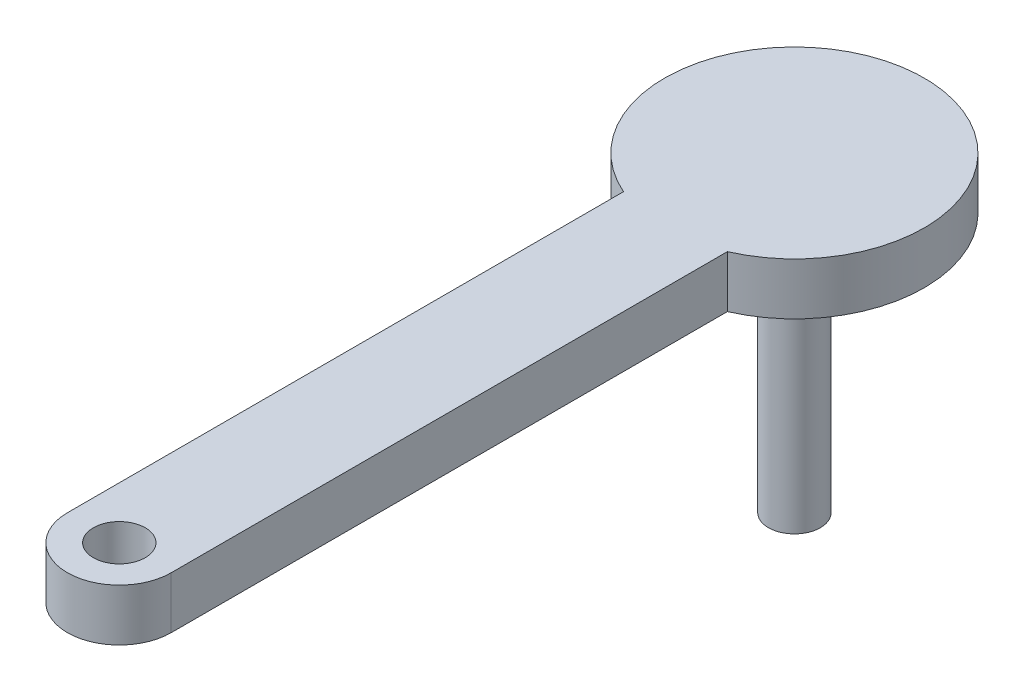
ISO-10303-21;
HEADER;
FILE_DESCRIPTION(('STEP AP214'),'2;1');
FILE_NAME('part.step','',(''),(''),'','','');
FILE_SCHEMA(('AUTOMOTIVE_DESIGN { 1 0 10303 214 1 1 1 1 }'));
ENDSEC;
DATA;
#1=APPLICATION_CONTEXT('core data for automotive mechanical design processes');
#2=APPLICATION_PROTOCOL_DEFINITION('international standard','automotive_design',2000,#1);
#3=PRODUCT_CONTEXT('',#1,'mechanical');
#4=PRODUCT('Part','Part','',(#3));
#5=PRODUCT_RELATED_PRODUCT_CATEGORY('part','',(#4));
#6=PRODUCT_DEFINITION_FORMATION('','',#4);
#7=PRODUCT_DEFINITION_CONTEXT('part definition',#1,'design');
#8=PRODUCT_DEFINITION('design','',#6,#7);
#9=PRODUCT_DEFINITION_SHAPE('','',#8);
#10=(LENGTH_UNIT() NAMED_UNIT(*) SI_UNIT(.MILLI.,.METRE.));
#11=(NAMED_UNIT(*) PLANE_ANGLE_UNIT() SI_UNIT($,.RADIAN.));
#12=(NAMED_UNIT(*) SI_UNIT($,.STERADIAN.) SOLID_ANGLE_UNIT());
#13=UNCERTAINTY_MEASURE_WITH_UNIT(LENGTH_MEASURE(1.E-05),#10,'distance_accuracy_value','');
#14=(GEOMETRIC_REPRESENTATION_CONTEXT(3) GLOBAL_UNCERTAINTY_ASSIGNED_CONTEXT((#13)) GLOBAL_UNIT_ASSIGNED_CONTEXT((#10,
#11,#12)) REPRESENTATION_CONTEXT('',''));
#15=CARTESIAN_POINT('',(0.,0.,0.));
#16=DIRECTION('',(0.,0.,1.));
#17=DIRECTION('',(1.,0.,0.));
#18=AXIS2_PLACEMENT_3D('',#15,#16,#17);
#19=CARTESIAN_POINT('',(0.,-50.,0.));
#20=DIRECTION('',(0.,-1.,0.));
#21=DIRECTION('',(0.,0.,-1.));
#22=AXIS2_PLACEMENT_3D('',#19,#20,#21);
#23=PLANE('',#22);
#24=CARTESIAN_POINT('',(0.,-50.,0.));
#25=DIRECTION('',(0.,-1.,0.));
#26=DIRECTION('',(1.,0.,0.));
#27=AXIS2_PLACEMENT_3D('',#24,#25,#26);
#28=CIRCLE('',#27,5.);
#29=CARTESIAN_POINT('',(5.,-50.,0.));
#30=VERTEX_POINT('',#29);
#31=EDGE_CURVE('E10',#30,#30,#28,.T.);
#32=ORIENTED_EDGE('',*,*,#31,.T.);
#33=EDGE_LOOP('',(#32));
#34=FACE_BOUND('',#33,.T.);
#35=ADVANCED_FACE('F16',(#34),#23,.T.);
#36=CARTESIAN_POINT('',(0.,-50.,0.));
#37=DIRECTION('',(0.,1.,0.));
#38=DIRECTION('',(0.,0.,1.));
#39=AXIS2_PLACEMENT_3D('',#36,#37,#38);
#40=CYLINDRICAL_SURFACE('',#39,5.);
#41=CARTESIAN_POINT('',(0.,0.,0.));
#42=DIRECTION('',(0.,-1.,0.));
#43=DIRECTION('',(1.,0.,0.));
#44=AXIS2_PLACEMENT_3D('',#41,#42,#43);
#45=CIRCLE('',#44,5.);
#46=CARTESIAN_POINT('',(5.,0.,0.));
#47=VERTEX_POINT('',#46);
#48=EDGE_CURVE('E127',#47,#47,#45,.T.);
#49=ORIENTED_EDGE('',*,*,#48,.T.);
#50=EDGE_LOOP('',(#49));
#51=FACE_BOUND('',#50,.T.);
#52=ORIENTED_EDGE('',*,*,#31,.F.);
#53=EDGE_LOOP('',(#52));
#54=FACE_BOUND('',#53,.T.);
#55=ADVANCED_FACE('F18',(#51,#54),#40,.T.);
#56=CARTESIAN_POINT('',(0.,21.610104935252,130.));
#57=DIRECTION('',(0.,-1.,0.));
#58=DIRECTION('',(0.,0.,-1.));
#59=AXIS2_PLACEMENT_3D('',#56,#57,#58);
#60=CYLINDRICAL_SURFACE('',#59,5.);
#61=CARTESIAN_POINT('',(0.,10.,130.));
#62=DIRECTION('',(0.,-1.,0.));
#63=DIRECTION('',(0.,0.,-1.));
#64=AXIS2_PLACEMENT_3D('',#61,#62,#63);
#65=CIRCLE('',#64,5.);
#66=CARTESIAN_POINT('',(0.,10.,125.));
#67=VERTEX_POINT('',#66);
#68=EDGE_CURVE('E130',#67,#67,#65,.T.);
#69=ORIENTED_EDGE('',*,*,#68,.F.);
#70=EDGE_LOOP('',(#69));
#71=FACE_BOUND('',#70,.T.);
#72=CARTESIAN_POINT('',(0.,0.,130.));
#73=DIRECTION('',(0.,-1.,0.));
#74=DIRECTION('',(1.,0.,0.));
#75=AXIS2_PLACEMENT_3D('',#72,#73,#74);
#76=CIRCLE('',#75,5.);
#77=CARTESIAN_POINT('',(5.,0.,130.));
#78=VERTEX_POINT('',#77);
#79=EDGE_CURVE('E26',#78,#78,#76,.T.);
#80=ORIENTED_EDGE('',*,*,#79,.T.);
#81=EDGE_LOOP('',(#80));
#82=FACE_BOUND('',#81,.T.);
#83=ADVANCED_FACE('F159',(#71,#82),#60,.F.);
#84=CARTESIAN_POINT('',(0.,0.,0.));
#85=DIRECTION('',(0.,-1.,0.));
#86=DIRECTION('',(0.,0.,-1.));
#87=AXIS2_PLACEMENT_3D('',#84,#85,#86);
#88=PLANE('',#87);
#89=CARTESIAN_POINT('',(0.,0.,0.));
#90=DIRECTION('',(0.,-1.,0.));
#91=DIRECTION('',(1.,0.,0.));
#92=AXIS2_PLACEMENT_3D('',#89,#90,#91);
#93=CIRCLE('',#92,25.);
#94=CARTESIAN_POINT('',(-10.,0.,22.9128784747792));
#95=VERTEX_POINT('',#94);
#96=CARTESIAN_POINT('',(10.,0.,22.9128784747792));
#97=VERTEX_POINT('',#96);
#98=EDGE_CURVE('E62',#95,#97,#93,.T.);
#99=ORIENTED_EDGE('',*,*,#98,.T.);
#100=DIRECTION('',(0.,0.,-1.));
#101=VECTOR('',#100,1.);
#102=CARTESIAN_POINT('',(10.,0.,130.));
#103=LINE('',#102,#101);
#104=CARTESIAN_POINT('',(10.,0.,130.));
#105=VERTEX_POINT('',#104);
#106=EDGE_CURVE('E88',#105,#97,#103,.T.);
#107=ORIENTED_EDGE('',*,*,#106,.F.);
#108=CARTESIAN_POINT('',(0.,0.,130.));
#109=DIRECTION('',(0.,-1.,0.));
#110=DIRECTION('',(1.,0.,0.));
#111=AXIS2_PLACEMENT_3D('',#108,#109,#110);
#112=CIRCLE('',#111,10.);
#113=CARTESIAN_POINT('',(-10.,0.,130.));
#114=VERTEX_POINT('',#113);
#115=EDGE_CURVE('E109',#105,#114,#112,.T.);
#116=ORIENTED_EDGE('',*,*,#115,.T.);
#117=DIRECTION('',(0.,0.,1.));
#118=VECTOR('',#117,1.);
#119=CARTESIAN_POINT('',(-10.,0.,130.));
#120=LINE('',#119,#118);
#121=EDGE_CURVE('E96',#95,#114,#120,.T.);
#122=ORIENTED_EDGE('',*,*,#121,.F.);
#123=EDGE_LOOP('',(#99,#107,#116,#122));
#124=FACE_BOUND('',#123,.T.);
#125=ORIENTED_EDGE('',*,*,#79,.F.);
#126=EDGE_LOOP('',(#125));
#127=FACE_BOUND('',#126,.T.);
#128=ORIENTED_EDGE('',*,*,#48,.F.);
#129=EDGE_LOOP('',(#128));
#130=FACE_BOUND('',#129,.T.);
#131=ADVANCED_FACE('F115',(#124,#127,#130),#88,.T.);
#132=CARTESIAN_POINT('',(0.,10.,0.));
#133=DIRECTION('',(0.,-1.,0.));
#134=DIRECTION('',(0.,0.,-1.));
#135=AXIS2_PLACEMENT_3D('',#132,#133,#134);
#136=PLANE('',#135);
#137=CARTESIAN_POINT('',(0.,10.,0.));
#138=DIRECTION('',(0.,-1.,0.));
#139=DIRECTION('',(1.,0.,0.));
#140=AXIS2_PLACEMENT_3D('',#137,#138,#139);
#141=CIRCLE('',#140,25.);
#142=CARTESIAN_POINT('',(-10.,10.,22.9128784747792));
#143=VERTEX_POINT('',#142);
#144=CARTESIAN_POINT('',(10.,10.,22.9128784747792));
#145=VERTEX_POINT('',#144);
#146=EDGE_CURVE('E73',#143,#145,#141,.T.);
#147=ORIENTED_EDGE('',*,*,#146,.F.);
#148=DIRECTION('',(0.,0.,1.));
#149=VECTOR('',#148,1.);
#150=CARTESIAN_POINT('',(-10.,10.,130.));
#151=LINE('',#150,#149);
#152=CARTESIAN_POINT('',(-10.,10.,130.));
#153=VERTEX_POINT('',#152);
#154=EDGE_CURVE('E131',#143,#153,#151,.T.);
#155=ORIENTED_EDGE('',*,*,#154,.T.);
#156=CARTESIAN_POINT('',(0.,10.,130.));
#157=DIRECTION('',(0.,-1.,0.));
#158=DIRECTION('',(1.,0.,0.));
#159=AXIS2_PLACEMENT_3D('',#156,#157,#158);
#160=CIRCLE('',#159,10.);
#161=CARTESIAN_POINT('',(10.,10.,130.));
#162=VERTEX_POINT('',#161);
#163=EDGE_CURVE('E111',#162,#153,#160,.T.);
#164=ORIENTED_EDGE('',*,*,#163,.F.);
#165=DIRECTION('',(0.,0.,-1.));
#166=VECTOR('',#165,1.);
#167=CARTESIAN_POINT('',(10.,10.,130.));
#168=LINE('',#167,#166);
#169=EDGE_CURVE('E113',#162,#145,#168,.T.);
#170=ORIENTED_EDGE('',*,*,#169,.T.);
#171=EDGE_LOOP('',(#147,#155,#164,#170));
#172=FACE_BOUND('',#171,.T.);
#173=ORIENTED_EDGE('',*,*,#68,.T.);
#174=EDGE_LOOP('',(#173));
#175=FACE_BOUND('',#174,.T.);
#176=ADVANCED_FACE('F153',(#172,#175),#136,.F.);
#177=CARTESIAN_POINT('',(0.,10.,0.));
#178=DIRECTION('',(0.,-1.,0.));
#179=DIRECTION('',(0.,0.,-1.));
#180=AXIS2_PLACEMENT_3D('',#177,#178,#179);
#181=CYLINDRICAL_SURFACE('',#180,25.);
#182=DIRECTION('',(0.,1.,0.));
#183=VECTOR('',#182,1.);
#184=CARTESIAN_POINT('',(10.,0.,22.9128784747792));
#185=LINE('',#184,#183);
#186=EDGE_CURVE('E134',#97,#145,#185,.T.);
#187=ORIENTED_EDGE('',*,*,#186,.F.);
#188=ORIENTED_EDGE('',*,*,#98,.F.);
#189=DIRECTION('',(0.,1.,0.));
#190=VECTOR('',#189,1.);
#191=CARTESIAN_POINT('',(-10.,0.,22.9128784747792));
#192=LINE('',#191,#190);
#193=EDGE_CURVE('E102',#95,#143,#192,.T.);
#194=ORIENTED_EDGE('',*,*,#193,.T.);
#195=ORIENTED_EDGE('',*,*,#146,.T.);
#196=EDGE_LOOP('',(#187,#188,#194,#195));
#197=FACE_BOUND('',#196,.T.);
#198=ADVANCED_FACE('F150',(#197),#181,.T.);
#199=CARTESIAN_POINT('',(-10.,0.,130.));
#200=DIRECTION('',(-1.,0.,0.));
#201=DIRECTION('',(0.,1.,0.));
#202=AXIS2_PLACEMENT_3D('',#199,#200,#201);
#203=PLANE('',#202);
#204=ORIENTED_EDGE('',*,*,#154,.F.);
#205=ORIENTED_EDGE('',*,*,#193,.F.);
#206=ORIENTED_EDGE('',*,*,#121,.T.);
#207=DIRECTION('',(0.,1.,0.));
#208=VECTOR('',#207,1.);
#209=CARTESIAN_POINT('',(-10.,0.,130.));
#210=LINE('',#209,#208);
#211=EDGE_CURVE('E100',#114,#153,#210,.T.);
#212=ORIENTED_EDGE('',*,*,#211,.T.);
#213=EDGE_LOOP('',(#204,#205,#206,#212));
#214=FACE_BOUND('',#213,.T.);
#215=ADVANCED_FACE('F99',(#214),#203,.T.);
#216=CARTESIAN_POINT('',(10.,0.,130.));
#217=DIRECTION('',(1.,0.,0.));
#218=DIRECTION('',(0.,0.,-1.));
#219=AXIS2_PLACEMENT_3D('',#216,#217,#218);
#220=PLANE('',#219);
#221=ORIENTED_EDGE('',*,*,#169,.F.);
#222=DIRECTION('',(0.,1.,0.));
#223=VECTOR('',#222,1.);
#224=CARTESIAN_POINT('',(10.,0.,130.));
#225=LINE('',#224,#223);
#226=EDGE_CURVE('E118',#105,#162,#225,.T.);
#227=ORIENTED_EDGE('',*,*,#226,.F.);
#228=ORIENTED_EDGE('',*,*,#106,.T.);
#229=ORIENTED_EDGE('',*,*,#186,.T.);
#230=EDGE_LOOP('',(#221,#227,#228,#229));
#231=FACE_BOUND('',#230,.T.);
#232=ADVANCED_FACE('F152',(#231),#220,.T.);
#233=CARTESIAN_POINT('',(0.,10.,130.));
#234=DIRECTION('',(0.,-1.,0.));
#235=DIRECTION('',(0.,0.,-1.));
#236=AXIS2_PLACEMENT_3D('',#233,#234,#235);
#237=CYLINDRICAL_SURFACE('',#236,10.);
#238=ORIENTED_EDGE('',*,*,#115,.F.);
#239=ORIENTED_EDGE('',*,*,#226,.T.);
#240=ORIENTED_EDGE('',*,*,#163,.T.);
#241=ORIENTED_EDGE('',*,*,#211,.F.);
#242=EDGE_LOOP('',(#238,#239,#240,#241));
#243=FACE_BOUND('',#242,.T.);
#244=ADVANCED_FACE('F107',(#243),#237,.T.);
#245=CLOSED_SHELL('',(#35,#55,#83,#131,#176,#198,#215,#232,#244));
#246=MANIFOLD_SOLID_BREP('B1',#245);
#247=ADVANCED_BREP_SHAPE_REPRESENTATION('',(#18,#246),#14);
#248=SHAPE_DEFINITION_REPRESENTATION(#9,#247);
ENDSEC;
END-ISO-10303-21;
